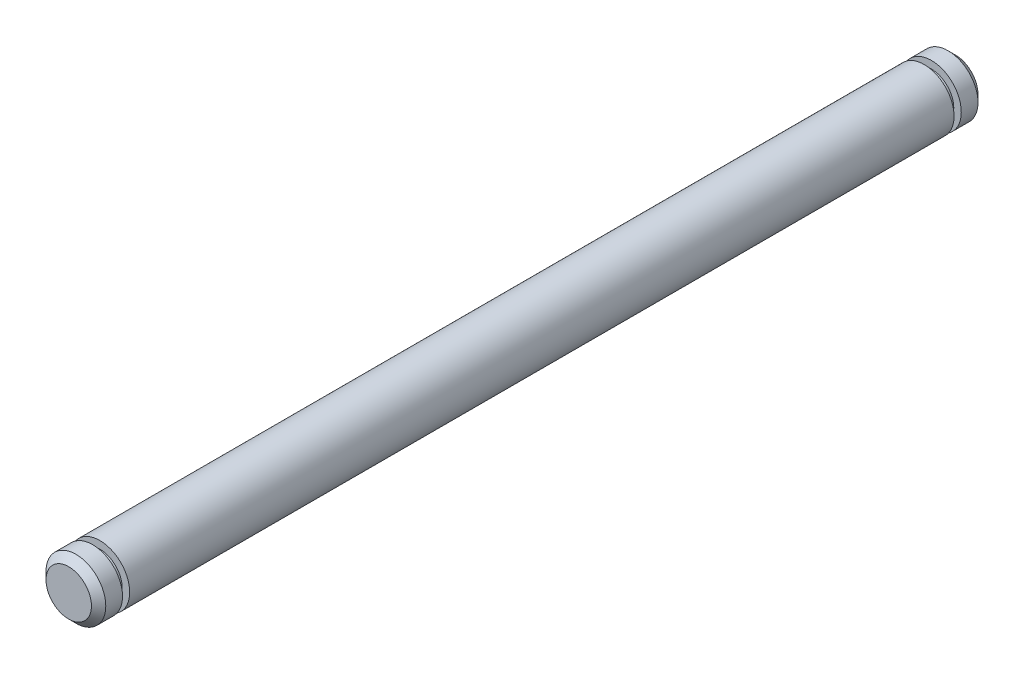
ISO-10303-21;
HEADER;
FILE_DESCRIPTION(('STEP AP214'),'2;1');
FILE_NAME('part.step','',(''),(''),'','','');
FILE_SCHEMA(('AUTOMOTIVE_DESIGN { 1 0 10303 214 1 1 1 1 }'));
ENDSEC;
DATA;
#1=APPLICATION_CONTEXT('core data for automotive mechanical design processes');
#2=APPLICATION_PROTOCOL_DEFINITION('international standard','automotive_design',2000,#1);
#3=PRODUCT_CONTEXT('',#1,'mechanical');
#4=PRODUCT('Part','Part','',(#3));
#5=PRODUCT_RELATED_PRODUCT_CATEGORY('part','',(#4));
#6=PRODUCT_DEFINITION_FORMATION('','',#4);
#7=PRODUCT_DEFINITION_CONTEXT('part definition',#1,'design');
#8=PRODUCT_DEFINITION('design','',#6,#7);
#9=PRODUCT_DEFINITION_SHAPE('','',#8);
#10=(LENGTH_UNIT() NAMED_UNIT(*) SI_UNIT(.MILLI.,.METRE.));
#11=(NAMED_UNIT(*) PLANE_ANGLE_UNIT() SI_UNIT($,.RADIAN.));
#12=(NAMED_UNIT(*) SI_UNIT($,.STERADIAN.) SOLID_ANGLE_UNIT());
#13=UNCERTAINTY_MEASURE_WITH_UNIT(LENGTH_MEASURE(1.E-05),#10,'distance_accuracy_value','');
#14=(GEOMETRIC_REPRESENTATION_CONTEXT(3) GLOBAL_UNCERTAINTY_ASSIGNED_CONTEXT((#13)) GLOBAL_UNIT_ASSIGNED_CONTEXT((#10,
#11,#12)) REPRESENTATION_CONTEXT('',''));
#15=CARTESIAN_POINT('',(0.,0.,0.));
#16=DIRECTION('',(0.,0.,1.));
#17=DIRECTION('',(1.,0.,0.));
#18=AXIS2_PLACEMENT_3D('',#15,#16,#17);
#19=CARTESIAN_POINT('',(0.,0.,21.89226));
#20=DIRECTION('',(0.,0.,-1.));
#21=DIRECTION('',(-1.,0.,0.));
#22=AXIS2_PLACEMENT_3D('',#19,#20,#21);
#23=CYLINDRICAL_SURFACE('',#22,1.5875);
#24=CARTESIAN_POINT('',(0.,0.,21.89226));
#25=DIRECTION('',(0.,0.,1.));
#26=DIRECTION('',(1.,0.,0.));
#27=AXIS2_PLACEMENT_3D('',#24,#25,#26);
#28=CIRCLE('',#27,1.5875);
#29=CARTESIAN_POINT('',(-1.5875,0.,21.89226));
#30=VERTEX_POINT('',#29);
#31=EDGE_CURVE('E62',#30,#30,#28,.T.);
#32=CARTESIAN_POINT('',(0.,0.,-21.89226));
#33=DIRECTION('',(0.,0.,1.));
#34=DIRECTION('',(1.,0.,0.));
#35=AXIS2_PLACEMENT_3D('',#32,#33,#34);
#36=CIRCLE('',#35,1.5875);
#37=CARTESIAN_POINT('',(-1.5875,0.,-21.89226));
#38=VERTEX_POINT('',#37);
#39=EDGE_CURVE('E59',#38,#38,#36,.T.);
#40=CARTESIAN_POINT('',(-1.5875,0.,21.89226));
#41=CARTESIAN_POINT('',(-1.5875,0.,21.43617125));
#42=CARTESIAN_POINT('',(-1.5875,0.,20.9800825));
#43=CARTESIAN_POINT('',(-1.5875,0.,20.067905));
#44=CARTESIAN_POINT('',(-1.5875,0.,19.61181625));
#45=CARTESIAN_POINT('',(-1.5875,0.,18.69963875));
#46=CARTESIAN_POINT('',(-1.5875,0.,18.24355));
#47=CARTESIAN_POINT('',(-1.5875,0.,17.3313725));
#48=CARTESIAN_POINT('',(-1.5875,0.,16.87528375));
#49=CARTESIAN_POINT('',(-1.5875,0.,15.96310625));
#50=CARTESIAN_POINT('',(-1.5875,0.,15.5070175));
#51=CARTESIAN_POINT('',(-1.5875,0.,14.59484));
#52=CARTESIAN_POINT('',(-1.5875,0.,14.13875125));
#53=CARTESIAN_POINT('',(-1.5875,0.,13.22657375));
#54=CARTESIAN_POINT('',(-1.5875,0.,12.770485));
#55=CARTESIAN_POINT('',(-1.5875,0.,11.8583075));
#56=CARTESIAN_POINT('',(-1.5875,0.,11.40221875));
#57=CARTESIAN_POINT('',(-1.5875,0.,10.49004125));
#58=CARTESIAN_POINT('',(-1.5875,0.,10.0339525));
#59=CARTESIAN_POINT('',(-1.5875,0.,9.121775));
#60=CARTESIAN_POINT('',(-1.5875,0.,8.66568625));
#61=CARTESIAN_POINT('',(-1.5875,0.,7.75350875));
#62=CARTESIAN_POINT('',(-1.5875,0.,7.29742));
#63=CARTESIAN_POINT('',(-1.5875,0.,6.3852425));
#64=CARTESIAN_POINT('',(-1.5875,0.,5.92915375));
#65=CARTESIAN_POINT('',(-1.5875,0.,5.01697625));
#66=CARTESIAN_POINT('',(-1.5875,0.,4.5608875));
#67=CARTESIAN_POINT('',(-1.5875,0.,3.64871));
#68=CARTESIAN_POINT('',(-1.5875,0.,3.19262125));
#69=CARTESIAN_POINT('',(-1.5875,0.,2.28044375));
#70=CARTESIAN_POINT('',(-1.5875,0.,1.824355));
#71=CARTESIAN_POINT('',(-1.5875,0.,0.912177499999996));
#72=CARTESIAN_POINT('',(-1.5875,0.,0.456088749999996));
#73=CARTESIAN_POINT('',(-1.5875,0.,-0.456088750000003));
#74=CARTESIAN_POINT('',(-1.5875,0.,-0.912177500000003));
#75=CARTESIAN_POINT('',(-1.5875,0.,-1.824355));
#76=CARTESIAN_POINT('',(-1.5875,0.,-2.28044375));
#77=CARTESIAN_POINT('',(-1.5875,0.,-3.19262125));
#78=CARTESIAN_POINT('',(-1.5875,0.,-3.64871));
#79=CARTESIAN_POINT('',(-1.5875,0.,-4.5608875));
#80=CARTESIAN_POINT('',(-1.5875,0.,-5.01697625));
#81=CARTESIAN_POINT('',(-1.5875,0.,-5.92915375));
#82=CARTESIAN_POINT('',(-1.5875,0.,-6.3852425));
#83=CARTESIAN_POINT('',(-1.5875,0.,-7.29742000000001));
#84=CARTESIAN_POINT('',(-1.5875,0.,-7.75350875000001));
#85=CARTESIAN_POINT('',(-1.5875,0.,-8.66568625));
#86=CARTESIAN_POINT('',(-1.5875,0.,-9.121775));
#87=CARTESIAN_POINT('',(-1.5875,0.,-10.0339525));
#88=CARTESIAN_POINT('',(-1.5875,0.,-10.49004125));
#89=CARTESIAN_POINT('',(-1.5875,0.,-11.40221875));
#90=CARTESIAN_POINT('',(-1.5875,0.,-11.8583075));
#91=CARTESIAN_POINT('',(-1.5875,0.,-12.770485));
#92=CARTESIAN_POINT('',(-1.5875,0.,-13.22657375));
#93=CARTESIAN_POINT('',(-1.5875,0.,-14.13875125));
#94=CARTESIAN_POINT('',(-1.5875,0.,-14.59484));
#95=CARTESIAN_POINT('',(-1.5875,0.,-15.5070175));
#96=CARTESIAN_POINT('',(-1.5875,0.,-15.96310625));
#97=CARTESIAN_POINT('',(-1.5875,0.,-16.87528375));
#98=CARTESIAN_POINT('',(-1.5875,0.,-17.3313725));
#99=CARTESIAN_POINT('',(-1.5875,0.,-18.24355));
#100=CARTESIAN_POINT('',(-1.5875,0.,-18.69963875));
#101=CARTESIAN_POINT('',(-1.5875,0.,-19.61181625));
#102=CARTESIAN_POINT('',(-1.5875,0.,-20.067905));
#103=CARTESIAN_POINT('',(-1.5875,0.,-20.9800825));
#104=CARTESIAN_POINT('',(-1.5875,0.,-21.43617125));
#105=CARTESIAN_POINT('',(-1.5875,0.,-21.89226));
#106=B_SPLINE_CURVE_WITH_KNOTS('',3,(#40,#41,#42,#43,#44,#45,#46,#47,#48,#49,#50,#51,#52,#53,
#54,#55,#56,#57,#58,#59,#60,#61,#62,#63,#64,#65,#66,#67,#68,#69,#70,#71,#72,#73,#74,#75,#76,#77,
#78,#79,#80,#81,#82,#83,#84,#85,#86,#87,#88,#89,#90,#91,#92,#93,#94,#95,#96,#97,#98,#99,#100,
#101,#102,#103,#104,#105),.UNSPECIFIED.,.F.,.F.,(4,2,2,2,2,2,2,2,2,2,2,2,2,2,2,2,2,2,2,2,2,2,2,
2,2,2,2,2,2,2,2,2,4),(0.,1.36826625,2.7365325,4.10479875,5.473065,6.84133125,8.2095975,
9.57786375,10.94613,12.31439625,13.6826625,15.05092875,16.419195,17.78746125,19.1557275,
20.52399375,21.89226,23.26052625,24.6287925,25.99705875,27.365325,28.73359125,30.1018575,
31.47012375,32.83839,34.20665625,35.5749225,36.94318875,38.311455,39.67972125,41.0479875,
42.41625375,43.78452),.UNSPECIFIED.);
#107=EDGE_CURVE('BSEAM37',#30,#38,#106,.T.);
#108=ORIENTED_EDGE('',*,*,#31,.F.);
#109=ORIENTED_EDGE('',*,*,#39,.T.);
#110=ORIENTED_EDGE('',*,*,#107,.T.);
#111=ORIENTED_EDGE('',*,*,#107,.F.);
#112=EDGE_LOOP('',(#108,#110,#109,#111));
#113=FACE_BOUND('',#112,.T.);
#114=ADVANCED_FACE('F37',(#113),#23,.T.);
#115=CARTESIAN_POINT('',(0.,0.,21.89226));
#116=DIRECTION('',(0.,0.,1.));
#117=DIRECTION('',(1.,0.,0.));
#118=AXIS2_PLACEMENT_3D('',#115,#116,#117);
#119=PLANE('',#118);
#120=CARTESIAN_POINT('',(0.,0.,21.89226));
#121=DIRECTION('',(0.,0.,1.));
#122=DIRECTION('',(1.,0.,0.));
#123=AXIS2_PLACEMENT_3D('',#120,#121,#122);
#124=CIRCLE('',#123,1.19126);
#125=CARTESIAN_POINT('',(-1.19126,0.,21.89226));
#126=VERTEX_POINT('',#125);
#127=EDGE_CURVE('E58',#126,#126,#124,.T.);
#128=ORIENTED_EDGE('',*,*,#127,.F.);
#129=EDGE_LOOP('',(#128));
#130=FACE_BOUND('',#129,.T.);
#131=ORIENTED_EDGE('',*,*,#31,.T.);
#132=EDGE_LOOP('',(#131));
#133=FACE_BOUND('',#132,.T.);
#134=ADVANCED_FACE('F100',(#130,#133),#119,.T.);
#135=CARTESIAN_POINT('',(0.,0.,-21.89226));
#136=DIRECTION('',(0.,0.,1.));
#137=DIRECTION('',(1.,0.,0.));
#138=AXIS2_PLACEMENT_3D('',#135,#136,#137);
#139=PLANE('',#138);
#140=CARTESIAN_POINT('',(0.,0.,-21.89226));
#141=DIRECTION('',(0.,0.,1.));
#142=DIRECTION('',(1.,0.,0.));
#143=AXIS2_PLACEMENT_3D('',#140,#141,#142);
#144=CIRCLE('',#143,1.19126);
#145=CARTESIAN_POINT('',(1.19126,0.,-21.89226));
#146=VERTEX_POINT('',#145);
#147=EDGE_CURVE('E73',#146,#146,#144,.T.);
#148=ORIENTED_EDGE('',*,*,#147,.T.);
#149=EDGE_LOOP('',(#148));
#150=FACE_BOUND('',#149,.T.);
#151=ORIENTED_EDGE('',*,*,#39,.F.);
#152=EDGE_LOOP('',(#151));
#153=FACE_BOUND('',#152,.T.);
#154=ADVANCED_FACE('F106',(#150,#153),#139,.F.);
#155=CARTESIAN_POINT('',(0.,0.,22.27326));
#156=DIRECTION('',(0.,0.,-1.));
#157=DIRECTION('',(-1.,0.,0.));
#158=AXIS2_PLACEMENT_3D('',#155,#156,#157);
#159=CYLINDRICAL_SURFACE('',#158,1.19126);
#160=CARTESIAN_POINT('',(0.,0.,22.27326));
#161=DIRECTION('',(0.,0.,1.));
#162=DIRECTION('',(1.,0.,0.));
#163=AXIS2_PLACEMENT_3D('',#160,#161,#162);
#164=CIRCLE('',#163,1.19126);
#165=CARTESIAN_POINT('',(-1.19126,0.,22.27326));
#166=VERTEX_POINT('',#165);
#167=EDGE_CURVE('E63',#166,#166,#164,.T.);
#168=CARTESIAN_POINT('',(-1.19126,0.,22.27326));
#169=CARTESIAN_POINT('',(-1.19126,0.,22.26929125));
#170=CARTESIAN_POINT('',(-1.19126,0.,22.2653225));
#171=CARTESIAN_POINT('',(-1.19126,0.,22.257385));
#172=CARTESIAN_POINT('',(-1.19126,0.,22.25341625));
#173=CARTESIAN_POINT('',(-1.19126,0.,22.24547875));
#174=CARTESIAN_POINT('',(-1.19126,0.,22.24151));
#175=CARTESIAN_POINT('',(-1.19126,0.,22.2335725));
#176=CARTESIAN_POINT('',(-1.19126,0.,22.22960375));
#177=CARTESIAN_POINT('',(-1.19126,0.,22.22166625));
#178=CARTESIAN_POINT('',(-1.19126,0.,22.2176975));
#179=CARTESIAN_POINT('',(-1.19126,0.,22.20976));
#180=CARTESIAN_POINT('',(-1.19126,0.,22.20579125));
#181=CARTESIAN_POINT('',(-1.19126,0.,22.19785375));
#182=CARTESIAN_POINT('',(-1.19126,0.,22.193885));
#183=CARTESIAN_POINT('',(-1.19126,0.,22.1859475));
#184=CARTESIAN_POINT('',(-1.19126,0.,22.18197875));
#185=CARTESIAN_POINT('',(-1.19126,0.,22.17404125));
#186=CARTESIAN_POINT('',(-1.19126,0.,22.1700725));
#187=CARTESIAN_POINT('',(-1.19126,0.,22.162135));
#188=CARTESIAN_POINT('',(-1.19126,0.,22.15816625));
#189=CARTESIAN_POINT('',(-1.19126,0.,22.15022875));
#190=CARTESIAN_POINT('',(-1.19126,0.,22.14626));
#191=CARTESIAN_POINT('',(-1.19126,0.,22.1383225));
#192=CARTESIAN_POINT('',(-1.19126,0.,22.13435375));
#193=CARTESIAN_POINT('',(-1.19126,0.,22.12641625));
#194=CARTESIAN_POINT('',(-1.19126,0.,22.1224475));
#195=CARTESIAN_POINT('',(-1.19126,0.,22.11451));
#196=CARTESIAN_POINT('',(-1.19126,0.,22.11054125));
#197=CARTESIAN_POINT('',(-1.19126,0.,22.10260375));
#198=CARTESIAN_POINT('',(-1.19126,0.,22.098635));
#199=CARTESIAN_POINT('',(-1.19126,0.,22.0906975));
#200=CARTESIAN_POINT('',(-1.19126,0.,22.08672875));
#201=CARTESIAN_POINT('',(-1.19126,0.,22.07879125));
#202=CARTESIAN_POINT('',(-1.19126,0.,22.0748225));
#203=CARTESIAN_POINT('',(-1.19126,0.,22.066885));
#204=CARTESIAN_POINT('',(-1.19126,0.,22.06291625));
#205=CARTESIAN_POINT('',(-1.19126,0.,22.05497875));
#206=CARTESIAN_POINT('',(-1.19126,0.,22.05101));
#207=CARTESIAN_POINT('',(-1.19126,0.,22.0430725));
#208=CARTESIAN_POINT('',(-1.19126,0.,22.03910375));
#209=CARTESIAN_POINT('',(-1.19126,0.,22.03116625));
#210=CARTESIAN_POINT('',(-1.19126,0.,22.0271975));
#211=CARTESIAN_POINT('',(-1.19126,0.,22.01926));
#212=CARTESIAN_POINT('',(-1.19126,0.,22.01529125));
#213=CARTESIAN_POINT('',(-1.19126,0.,22.00735375));
#214=CARTESIAN_POINT('',(-1.19126,0.,22.003385));
#215=CARTESIAN_POINT('',(-1.19126,0.,21.9954475));
#216=CARTESIAN_POINT('',(-1.19126,0.,21.99147875));
#217=CARTESIAN_POINT('',(-1.19126,0.,21.98354125));
#218=CARTESIAN_POINT('',(-1.19126,0.,21.9795725));
#219=CARTESIAN_POINT('',(-1.19126,0.,21.971635));
#220=CARTESIAN_POINT('',(-1.19126,0.,21.96766625));
#221=CARTESIAN_POINT('',(-1.19126,0.,21.95972875));
#222=CARTESIAN_POINT('',(-1.19126,0.,21.95576));
#223=CARTESIAN_POINT('',(-1.19126,0.,21.9478225));
#224=CARTESIAN_POINT('',(-1.19126,0.,21.94385375));
#225=CARTESIAN_POINT('',(-1.19126,0.,21.93591625));
#226=CARTESIAN_POINT('',(-1.19126,0.,21.9319475));
#227=CARTESIAN_POINT('',(-1.19126,0.,21.92401));
#228=CARTESIAN_POINT('',(-1.19126,0.,21.92004125));
#229=CARTESIAN_POINT('',(-1.19126,0.,21.91210375));
#230=CARTESIAN_POINT('',(-1.19126,0.,21.908135));
#231=CARTESIAN_POINT('',(-1.19126,0.,21.9001975));
#232=CARTESIAN_POINT('',(-1.19126,0.,21.89622875));
#233=CARTESIAN_POINT('',(-1.19126,0.,21.89226));
#234=B_SPLINE_CURVE_WITH_KNOTS('',3,(#168,#169,#170,#171,#172,#173,#174,#175,#176,#177,#178,
#179,#180,#181,#182,#183,#184,#185,#186,#187,#188,#189,#190,#191,#192,#193,#194,#195,#196,#197,
#198,#199,#200,#201,#202,#203,#204,#205,#206,#207,#208,#209,#210,#211,#212,#213,#214,#215,#216,
#217,#218,#219,#220,#221,#222,#223,#224,#225,#226,#227,#228,#229,#230,#231,#232,#233),
.UNSPECIFIED.,.F.,.F.,(4,2,2,2,2,2,2,2,2,2,2,2,2,2,2,2,2,2,2,2,2,2,2,2,2,2,2,2,2,2,2,2,4),(0.,
0.0119062499999989,0.0238124999999978,0.0357187499999967,0.0476249999999991,0.059531249999998,
0.0714374999999969,0.0833437499999992,0.0952499999999981,0.107156249999997,0.119062499999999,
0.130968749999998,0.142874999999997,0.15478125,0.166687499999998,0.178593749999997,
0.190499999999996,0.202406249999999,0.214312499999997,0.226218749999996,0.238124999999999,
0.250031249999998,0.261937499999997,0.273843749999999,0.285749999999998,0.297656249999997,
0.309562499999999,0.321468749999998,0.333374999999997,0.345281249999999,0.357187499999998,
0.369093749999997,0.380999999999996),.UNSPECIFIED.);
#235=EDGE_CURVE('BSEAM134',#166,#126,#234,.T.);
#236=ORIENTED_EDGE('',*,*,#167,.F.);
#237=ORIENTED_EDGE('',*,*,#127,.T.);
#238=ORIENTED_EDGE('',*,*,#235,.T.);
#239=ORIENTED_EDGE('',*,*,#235,.F.);
#240=EDGE_LOOP('',(#236,#238,#237,#239));
#241=FACE_BOUND('',#240,.T.);
#242=ADVANCED_FACE('F134',(#241),#159,.T.);
#243=CARTESIAN_POINT('',(0.,0.,23.54326));
#244=DIRECTION('',(0.,0.,-1.));
#245=DIRECTION('',(-1.,0.,0.));
#246=AXIS2_PLACEMENT_3D('',#243,#244,#245);
#247=CYLINDRICAL_SURFACE('',#246,1.5875);
#248=CARTESIAN_POINT('',(0.,0.,23.16226));
#249=DIRECTION('',(0.,0.,1.));
#250=DIRECTION('',(1.,0.,0.));
#251=AXIS2_PLACEMENT_3D('',#248,#249,#250);
#252=CIRCLE('',#251,1.5875);
#253=CARTESIAN_POINT('',(1.5875,0.,23.16226));
#254=VERTEX_POINT('',#253);
#255=EDGE_CURVE('E49',#254,#254,#252,.F.);
#256=ORIENTED_EDGE('',*,*,#255,.T.);
#257=EDGE_LOOP('',(#256));
#258=FACE_BOUND('',#257,.T.);
#259=CARTESIAN_POINT('',(0.,0.,22.27326));
#260=DIRECTION('',(0.,0.,1.));
#261=DIRECTION('',(1.,0.,0.));
#262=AXIS2_PLACEMENT_3D('',#259,#260,#261);
#263=CIRCLE('',#262,1.5875);
#264=CARTESIAN_POINT('',(1.5875,0.,22.27326));
#265=VERTEX_POINT('',#264);
#266=EDGE_CURVE('E70',#265,#265,#263,.T.);
#267=ORIENTED_EDGE('',*,*,#266,.T.);
#268=EDGE_LOOP('',(#267));
#269=FACE_BOUND('',#268,.T.);
#270=ADVANCED_FACE('F129',(#258,#269),#247,.T.);
#271=CARTESIAN_POINT('',(0.,0.,23.54326));
#272=DIRECTION('',(0.,0.,1.));
#273=DIRECTION('',(1.,0.,0.));
#274=AXIS2_PLACEMENT_3D('',#271,#272,#273);
#275=PLANE('',#274);
#276=CARTESIAN_POINT('',(0.,0.,23.54326));
#277=DIRECTION('',(0.,0.,1.));
#278=DIRECTION('',(1.,0.,0.));
#279=AXIS2_PLACEMENT_3D('',#276,#277,#278);
#280=CIRCLE('',#279,1.2065);
#281=CARTESIAN_POINT('',(1.2065,0.,23.54326));
#282=VERTEX_POINT('',#281);
#283=EDGE_CURVE('E53',#282,#282,#280,.T.);
#284=ORIENTED_EDGE('',*,*,#283,.T.);
#285=EDGE_LOOP('',(#284));
#286=FACE_BOUND('',#285,.T.);
#287=ADVANCED_FACE('F121',(#286),#275,.T.);
#288=CARTESIAN_POINT('',(0.,0.,22.27326));
#289=DIRECTION('',(0.,0.,1.));
#290=DIRECTION('',(1.,0.,0.));
#291=AXIS2_PLACEMENT_3D('',#288,#289,#290);
#292=PLANE('',#291);
#293=ORIENTED_EDGE('',*,*,#167,.T.);
#294=EDGE_LOOP('',(#293));
#295=FACE_BOUND('',#294,.T.);
#296=ORIENTED_EDGE('',*,*,#266,.F.);
#297=EDGE_LOOP('',(#296));
#298=FACE_BOUND('',#297,.T.);
#299=ADVANCED_FACE('F116',(#295,#298),#292,.F.);
#300=CARTESIAN_POINT('',(0.,0.,23.54326));
#301=DIRECTION('',(0.,0.,-1.));
#302=DIRECTION('',(-1.,0.,0.));
#303=AXIS2_PLACEMENT_3D('',#300,#301,#302);
#304=CONICAL_SURFACE('',#303,1.2065,0.785398163397446);
#305=ORIENTED_EDGE('',*,*,#255,.F.);
#306=EDGE_LOOP('',(#305));
#307=FACE_BOUND('',#306,.T.);
#308=ORIENTED_EDGE('',*,*,#283,.F.);
#309=EDGE_LOOP('',(#308));
#310=FACE_BOUND('',#309,.T.);
#311=ADVANCED_FACE('F95',(#307,#310),#304,.T.);
#312=CARTESIAN_POINT('',(0.,0.,-22.27326));
#313=DIRECTION('',(0.,0.,1.));
#314=DIRECTION('',(1.,0.,0.));
#315=AXIS2_PLACEMENT_3D('',#312,#313,#314);
#316=CYLINDRICAL_SURFACE('',#315,1.19126);
#317=CARTESIAN_POINT('',(0.,0.,-22.27326));
#318=DIRECTION('',(0.,0.,1.));
#319=DIRECTION('',(1.,0.,0.));
#320=AXIS2_PLACEMENT_3D('',#317,#318,#319);
#321=CIRCLE('',#320,1.19126);
#322=CARTESIAN_POINT('',(1.19126,0.,-22.27326));
#323=VERTEX_POINT('',#322);
#324=EDGE_CURVE('E76',#323,#323,#321,.T.);
#325=CARTESIAN_POINT('',(1.19126,0.,-22.27326));
#326=CARTESIAN_POINT('',(1.19126,0.,-22.26929125));
#327=CARTESIAN_POINT('',(1.19126,0.,-22.2653225));
#328=CARTESIAN_POINT('',(1.19126,0.,-22.257385));
#329=CARTESIAN_POINT('',(1.19126,0.,-22.25341625));
#330=CARTESIAN_POINT('',(1.19126,0.,-22.24547875));
#331=CARTESIAN_POINT('',(1.19126,0.,-22.24151));
#332=CARTESIAN_POINT('',(1.19126,0.,-22.2335725));
#333=CARTESIAN_POINT('',(1.19126,0.,-22.22960375));
#334=CARTESIAN_POINT('',(1.19126,0.,-22.22166625));
#335=CARTESIAN_POINT('',(1.19126,0.,-22.2176975));
#336=CARTESIAN_POINT('',(1.19126,0.,-22.20976));
#337=CARTESIAN_POINT('',(1.19126,0.,-22.20579125));
#338=CARTESIAN_POINT('',(1.19126,0.,-22.19785375));
#339=CARTESIAN_POINT('',(1.19126,0.,-22.193885));
#340=CARTESIAN_POINT('',(1.19126,0.,-22.1859475));
#341=CARTESIAN_POINT('',(1.19126,0.,-22.18197875));
#342=CARTESIAN_POINT('',(1.19126,0.,-22.17404125));
#343=CARTESIAN_POINT('',(1.19126,0.,-22.1700725));
#344=CARTESIAN_POINT('',(1.19126,0.,-22.162135));
#345=CARTESIAN_POINT('',(1.19126,0.,-22.15816625));
#346=CARTESIAN_POINT('',(1.19126,0.,-22.15022875));
#347=CARTESIAN_POINT('',(1.19126,0.,-22.14626));
#348=CARTESIAN_POINT('',(1.19126,0.,-22.1383225));
#349=CARTESIAN_POINT('',(1.19126,0.,-22.13435375));
#350=CARTESIAN_POINT('',(1.19126,0.,-22.12641625));
#351=CARTESIAN_POINT('',(1.19126,0.,-22.1224475));
#352=CARTESIAN_POINT('',(1.19126,0.,-22.11451));
#353=CARTESIAN_POINT('',(1.19126,0.,-22.11054125));
#354=CARTESIAN_POINT('',(1.19126,0.,-22.10260375));
#355=CARTESIAN_POINT('',(1.19126,0.,-22.098635));
#356=CARTESIAN_POINT('',(1.19126,0.,-22.0906975));
#357=CARTESIAN_POINT('',(1.19126,0.,-22.08672875));
#358=CARTESIAN_POINT('',(1.19126,0.,-22.07879125));
#359=CARTESIAN_POINT('',(1.19126,0.,-22.0748225));
#360=CARTESIAN_POINT('',(1.19126,0.,-22.066885));
#361=CARTESIAN_POINT('',(1.19126,0.,-22.06291625));
#362=CARTESIAN_POINT('',(1.19126,0.,-22.05497875));
#363=CARTESIAN_POINT('',(1.19126,0.,-22.05101));
#364=CARTESIAN_POINT('',(1.19126,0.,-22.0430725));
#365=CARTESIAN_POINT('',(1.19126,0.,-22.03910375));
#366=CARTESIAN_POINT('',(1.19126,0.,-22.03116625));
#367=CARTESIAN_POINT('',(1.19126,0.,-22.0271975));
#368=CARTESIAN_POINT('',(1.19126,0.,-22.01926));
#369=CARTESIAN_POINT('',(1.19126,0.,-22.01529125));
#370=CARTESIAN_POINT('',(1.19126,0.,-22.00735375));
#371=CARTESIAN_POINT('',(1.19126,0.,-22.003385));
#372=CARTESIAN_POINT('',(1.19126,0.,-21.9954475));
#373=CARTESIAN_POINT('',(1.19126,0.,-21.99147875));
#374=CARTESIAN_POINT('',(1.19126,0.,-21.98354125));
#375=CARTESIAN_POINT('',(1.19126,0.,-21.9795725));
#376=CARTESIAN_POINT('',(1.19126,0.,-21.971635));
#377=CARTESIAN_POINT('',(1.19126,0.,-21.96766625));
#378=CARTESIAN_POINT('',(1.19126,0.,-21.95972875));
#379=CARTESIAN_POINT('',(1.19126,0.,-21.95576));
#380=CARTESIAN_POINT('',(1.19126,0.,-21.9478225));
#381=CARTESIAN_POINT('',(1.19126,0.,-21.94385375));
#382=CARTESIAN_POINT('',(1.19126,0.,-21.93591625));
#383=CARTESIAN_POINT('',(1.19126,0.,-21.9319475));
#384=CARTESIAN_POINT('',(1.19126,0.,-21.92401));
#385=CARTESIAN_POINT('',(1.19126,0.,-21.92004125));
#386=CARTESIAN_POINT('',(1.19126,0.,-21.91210375));
#387=CARTESIAN_POINT('',(1.19126,0.,-21.908135));
#388=CARTESIAN_POINT('',(1.19126,0.,-21.9001975));
#389=CARTESIAN_POINT('',(1.19126,0.,-21.89622875));
#390=CARTESIAN_POINT('',(1.19126,0.,-21.89226));
#391=B_SPLINE_CURVE_WITH_KNOTS('',3,(#325,#326,#327,#328,#329,#330,#331,#332,#333,#334,#335,
#336,#337,#338,#339,#340,#341,#342,#343,#344,#345,#346,#347,#348,#349,#350,#351,#352,#353,#354,
#355,#356,#357,#358,#359,#360,#361,#362,#363,#364,#365,#366,#367,#368,#369,#370,#371,#372,#373,
#374,#375,#376,#377,#378,#379,#380,#381,#382,#383,#384,#385,#386,#387,#388,#389,#390),
.UNSPECIFIED.,.F.,.F.,(4,2,2,2,2,2,2,2,2,2,2,2,2,2,2,2,2,2,2,2,2,2,2,2,2,2,2,2,2,2,2,2,4),(0.,
0.0119062500000024,0.0238125000000013,0.0357187500000002,0.0476250000000025,0.0595312500000014,
0.0714375000000003,0.0833437500000027,0.0952500000000016,0.10715625,0.119062500000003,
0.130968750000002,0.142875000000001,0.154781250000003,0.166687500000002,0.178593750000001,
0.190500000000003,0.202406250000002,0.214312500000001,0.22621875,0.238125000000002,
0.250031250000001,0.2619375,0.273843750000002,0.285750000000001,0.29765625,0.309562500000003,
0.321468750000001,0.333375,0.345281250000003,0.357187500000002,0.36909375,0.381000000000003),.UNSPECIFIED.);
#392=EDGE_CURVE('BSEAM88',#323,#146,#391,.T.);
#393=ORIENTED_EDGE('',*,*,#324,.T.);
#394=ORIENTED_EDGE('',*,*,#147,.F.);
#395=ORIENTED_EDGE('',*,*,#392,.T.);
#396=ORIENTED_EDGE('',*,*,#392,.F.);
#397=EDGE_LOOP('',(#393,#395,#394,#396));
#398=FACE_BOUND('',#397,.T.);
#399=ADVANCED_FACE('F88',(#398),#316,.T.);
#400=CARTESIAN_POINT('',(0.,0.,-23.54326));
#401=DIRECTION('',(0.,0.,1.));
#402=DIRECTION('',(1.,0.,0.));
#403=AXIS2_PLACEMENT_3D('',#400,#401,#402);
#404=CYLINDRICAL_SURFACE('',#403,1.5875);
#405=CARTESIAN_POINT('',(0.,0.,-23.16226));
#406=DIRECTION('',(0.,0.,-1.));
#407=DIRECTION('',(-1.,0.,0.));
#408=AXIS2_PLACEMENT_3D('',#405,#406,#407);
#409=CIRCLE('',#408,1.5875);
#410=CARTESIAN_POINT('',(-1.5875,0.,-23.16226));
#411=VERTEX_POINT('',#410);
#412=EDGE_CURVE('E45',#411,#411,#409,.F.);
#413=ORIENTED_EDGE('',*,*,#412,.T.);
#414=EDGE_LOOP('',(#413));
#415=FACE_BOUND('',#414,.T.);
#416=CARTESIAN_POINT('',(0.,0.,-22.27326));
#417=DIRECTION('',(0.,0.,1.));
#418=DIRECTION('',(1.,0.,0.));
#419=AXIS2_PLACEMENT_3D('',#416,#417,#418);
#420=CIRCLE('',#419,1.5875);
#421=CARTESIAN_POINT('',(1.5875,0.,-22.27326));
#422=VERTEX_POINT('',#421);
#423=EDGE_CURVE('E79',#422,#422,#420,.T.);
#424=ORIENTED_EDGE('',*,*,#423,.F.);
#425=EDGE_LOOP('',(#424));
#426=FACE_BOUND('',#425,.T.);
#427=ADVANCED_FACE('F85',(#415,#426),#404,.T.);
#428=CARTESIAN_POINT('',(0.,0.,-23.54326));
#429=DIRECTION('',(0.,0.,-1.));
#430=DIRECTION('',(1.,0.,0.));
#431=AXIS2_PLACEMENT_3D('',#428,#429,#430);
#432=PLANE('',#431);
#433=CARTESIAN_POINT('',(0.,0.,-23.54326));
#434=DIRECTION('',(0.,0.,-1.));
#435=DIRECTION('',(-1.,0.,0.));
#436=AXIS2_PLACEMENT_3D('',#433,#434,#435);
#437=CIRCLE('',#436,1.20649999999999);
#438=CARTESIAN_POINT('',(-1.20649999999999,0.,-23.54326));
#439=VERTEX_POINT('',#438);
#440=EDGE_CURVE('E10',#439,#439,#437,.T.);
#441=ORIENTED_EDGE('',*,*,#440,.T.);
#442=EDGE_LOOP('',(#441));
#443=FACE_BOUND('',#442,.T.);
#444=ADVANCED_FACE('F87',(#443),#432,.T.);
#445=CARTESIAN_POINT('',(0.,0.,-22.27326));
#446=DIRECTION('',(0.,0.,-1.));
#447=DIRECTION('',(1.,0.,0.));
#448=AXIS2_PLACEMENT_3D('',#445,#446,#447);
#449=PLANE('',#448);
#450=ORIENTED_EDGE('',*,*,#324,.F.);
#451=EDGE_LOOP('',(#450));
#452=FACE_BOUND('',#451,.T.);
#453=ORIENTED_EDGE('',*,*,#423,.T.);
#454=EDGE_LOOP('',(#453));
#455=FACE_BOUND('',#454,.T.);
#456=ADVANCED_FACE('F83',(#452,#455),#449,.F.);
#457=CARTESIAN_POINT('',(0.,0.,-23.16226));
#458=DIRECTION('',(0.,0.,1.));
#459=DIRECTION('',(1.,0.,0.));
#460=AXIS2_PLACEMENT_3D('',#457,#458,#459);
#461=CONICAL_SURFACE('',#460,1.5875,0.785398163397446);
#462=ORIENTED_EDGE('',*,*,#440,.F.);
#463=EDGE_LOOP('',(#462));
#464=FACE_BOUND('',#463,.T.);
#465=ORIENTED_EDGE('',*,*,#412,.F.);
#466=EDGE_LOOP('',(#465));
#467=FACE_BOUND('',#466,.T.);
#468=ADVANCED_FACE('F40',(#464,#467),#461,.T.);
#469=CLOSED_SHELL('',(#114,#134,#154,#242,#270,#287,#299,#311,#399,#427,#444,#456,#468));
#470=MANIFOLD_SOLID_BREP('B2',#469);
#471=ADVANCED_BREP_SHAPE_REPRESENTATION('',(#18,#470),#14);
#472=SHAPE_DEFINITION_REPRESENTATION(#9,#471);
ENDSEC;
END-ISO-10303-21;
